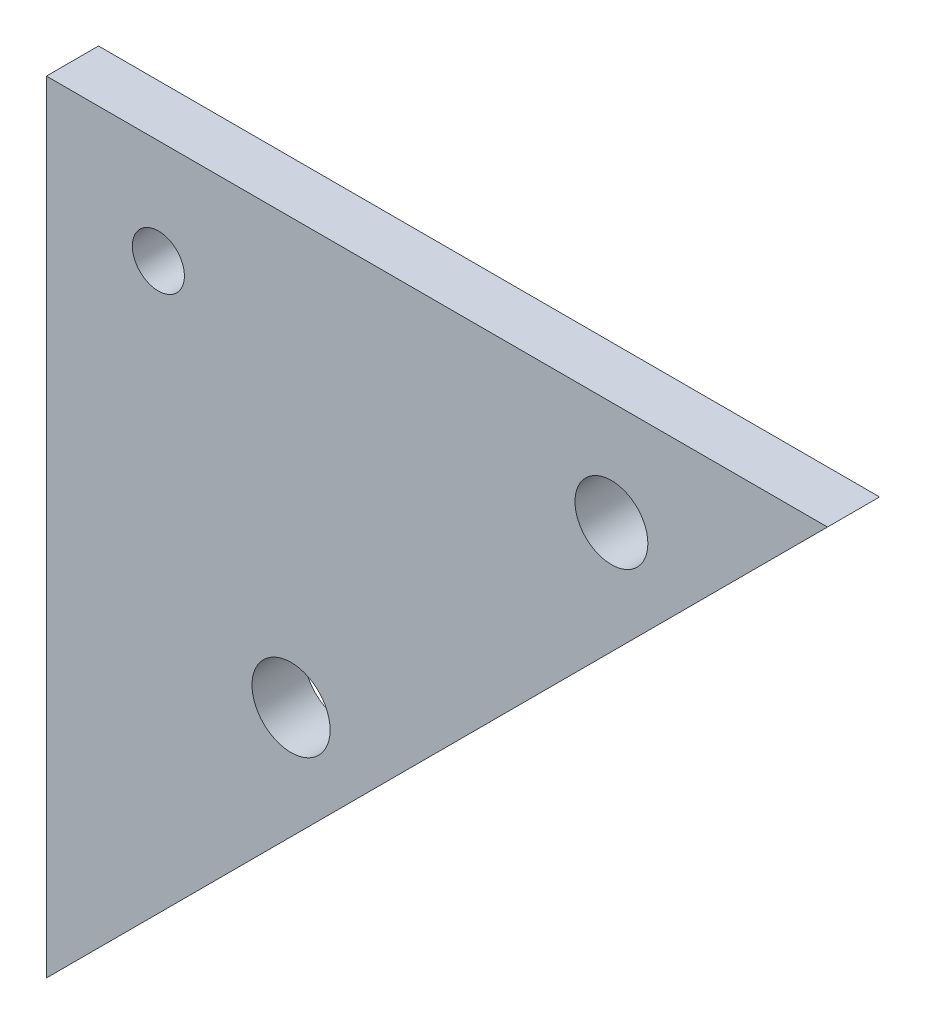
ISO-10303-21;
HEADER;
FILE_DESCRIPTION(('STEP AP214'),'2;1');
FILE_NAME('part.step','',(''),(''),'','','');
FILE_SCHEMA(('AUTOMOTIVE_DESIGN { 1 0 10303 214 1 1 1 1 }'));
ENDSEC;
DATA;
#1=APPLICATION_CONTEXT('core data for automotive mechanical design processes');
#2=APPLICATION_PROTOCOL_DEFINITION('international standard','automotive_design',2000,#1);
#3=PRODUCT_CONTEXT('',#1,'mechanical');
#4=PRODUCT('Part','Part','',(#3));
#5=PRODUCT_RELATED_PRODUCT_CATEGORY('part','',(#4));
#6=PRODUCT_DEFINITION_FORMATION('','',#4);
#7=PRODUCT_DEFINITION_CONTEXT('part definition',#1,'design');
#8=PRODUCT_DEFINITION('design','',#6,#7);
#9=PRODUCT_DEFINITION_SHAPE('','',#8);
#10=(LENGTH_UNIT() NAMED_UNIT(*) SI_UNIT(.MILLI.,.METRE.));
#11=(NAMED_UNIT(*) PLANE_ANGLE_UNIT() SI_UNIT($,.RADIAN.));
#12=(NAMED_UNIT(*) SI_UNIT($,.STERADIAN.) SOLID_ANGLE_UNIT());
#13=UNCERTAINTY_MEASURE_WITH_UNIT(LENGTH_MEASURE(1.E-05),#10,'distance_accuracy_value','');
#14=(GEOMETRIC_REPRESENTATION_CONTEXT(3) GLOBAL_UNCERTAINTY_ASSIGNED_CONTEXT((#13)) GLOBAL_UNIT_ASSIGNED_CONTEXT((#10,
#11,#12)) REPRESENTATION_CONTEXT('',''));
#15=CARTESIAN_POINT('',(0.,0.,0.));
#16=DIRECTION('',(0.,0.,1.));
#17=DIRECTION('',(1.,0.,0.));
#18=AXIS2_PLACEMENT_3D('',#15,#16,#17);
#19=CARTESIAN_POINT('',(-38.1,24.5751826876415,2.54));
#20=DIRECTION('',(1.,0.,0.));
#21=DIRECTION('',(0.,1.,0.));
#22=AXIS2_PLACEMENT_3D('',#19,#20,#21);
#23=PLANE('',#22);
#24=DIRECTION('',(0.,-1.,0.));
#25=VECTOR('',#24,1.);
#26=CARTESIAN_POINT('',(-38.1,24.5751826876415,0.));
#27=LINE('',#26,#25);
#28=CARTESIAN_POINT('',(-38.1,24.5751826876415,0.));
#29=VERTEX_POINT('',#28);
#30=CARTESIAN_POINT('',(-38.1,-13.5248173123586,0.));
#31=VERTEX_POINT('',#30);
#32=EDGE_CURVE('E83',#29,#31,#27,.T.);
#33=ORIENTED_EDGE('',*,*,#32,.T.);
#34=DIRECTION('',(0.,0.,-1.));
#35=VECTOR('',#34,1.);
#36=CARTESIAN_POINT('',(-38.1,-13.5248173123586,2.54));
#37=LINE('',#36,#35);
#38=CARTESIAN_POINT('',(-38.1,-13.5248173123586,2.54));
#39=VERTEX_POINT('',#38);
#40=EDGE_CURVE('E11',#39,#31,#37,.T.);
#41=ORIENTED_EDGE('',*,*,#40,.F.);
#42=DIRECTION('',(0.,-1.,0.));
#43=VECTOR('',#42,1.);
#44=CARTESIAN_POINT('',(-38.1,24.5751826876415,2.54));
#45=LINE('',#44,#43);
#46=CARTESIAN_POINT('',(-38.1,24.5751826876415,2.54));
#47=VERTEX_POINT('',#46);
#48=EDGE_CURVE('E76',#47,#39,#45,.T.);
#49=ORIENTED_EDGE('',*,*,#48,.F.);
#50=DIRECTION('',(0.,0.,-1.));
#51=VECTOR('',#50,1.);
#52=CARTESIAN_POINT('',(-38.1,24.5751826876415,2.54));
#53=LINE('',#52,#51);
#54=EDGE_CURVE('E84',#47,#29,#53,.T.);
#55=ORIENTED_EDGE('',*,*,#54,.T.);
#56=EDGE_LOOP('',(#33,#41,#49,#55));
#57=FACE_BOUND('',#56,.T.);
#58=ADVANCED_FACE('F36',(#57),#23,.F.);
#59=CARTESIAN_POINT('',(-38.1,-13.5248173123586,2.54));
#60=DIRECTION('',(-0.707106781186548,0.707106781186547,0.));
#61=DIRECTION('',(-0.707106781186547,-0.707106781186548,0.));
#62=AXIS2_PLACEMENT_3D('',#59,#60,#61);
#63=PLANE('',#62);
#64=DIRECTION('',(0.707106781186547,0.707106781186548,0.));
#65=VECTOR('',#64,1.);
#66=CARTESIAN_POINT('',(-38.1,-13.5248173123586,0.));
#67=LINE('',#66,#65);
#68=CARTESIAN_POINT('',(0.,24.5751826876415,0.));
#69=VERTEX_POINT('',#68);
#70=EDGE_CURVE('E64',#31,#69,#67,.T.);
#71=ORIENTED_EDGE('',*,*,#70,.T.);
#72=DIRECTION('',(0.,0.,-1.));
#73=VECTOR('',#72,1.);
#74=CARTESIAN_POINT('',(0.,24.5751826876415,2.54));
#75=LINE('',#74,#73);
#76=CARTESIAN_POINT('',(0.,24.5751826876415,2.54));
#77=VERTEX_POINT('',#76);
#78=EDGE_CURVE('E44',#77,#69,#75,.T.);
#79=ORIENTED_EDGE('',*,*,#78,.F.);
#80=DIRECTION('',(0.707106781186547,0.707106781186548,0.));
#81=VECTOR('',#80,1.);
#82=CARTESIAN_POINT('',(-38.1,-13.5248173123586,2.54));
#83=LINE('',#82,#81);
#84=EDGE_CURVE('E72',#39,#77,#83,.T.);
#85=ORIENTED_EDGE('',*,*,#84,.F.);
#86=ORIENTED_EDGE('',*,*,#40,.T.);
#87=EDGE_LOOP('',(#71,#79,#85,#86));
#88=FACE_BOUND('',#87,.T.);
#89=ADVANCED_FACE('F73',(#88),#63,.F.);
#90=CARTESIAN_POINT('',(0.,24.5751826876415,2.54));
#91=DIRECTION('',(0.,-1.,0.));
#92=DIRECTION('',(1.,0.,0.));
#93=AXIS2_PLACEMENT_3D('',#90,#91,#92);
#94=PLANE('',#93);
#95=DIRECTION('',(-1.,0.,0.));
#96=VECTOR('',#95,1.);
#97=CARTESIAN_POINT('',(0.,24.5751826876415,0.));
#98=LINE('',#97,#96);
#99=EDGE_CURVE('E69',#69,#29,#98,.T.);
#100=ORIENTED_EDGE('',*,*,#99,.T.);
#101=ORIENTED_EDGE('',*,*,#54,.F.);
#102=DIRECTION('',(-1.,0.,0.));
#103=VECTOR('',#102,1.);
#104=CARTESIAN_POINT('',(0.,24.5751826876415,2.54));
#105=LINE('',#104,#103);
#106=EDGE_CURVE('E52',#77,#47,#105,.T.);
#107=ORIENTED_EDGE('',*,*,#106,.F.);
#108=ORIENTED_EDGE('',*,*,#78,.T.);
#109=EDGE_LOOP('',(#100,#101,#107,#108));
#110=FACE_BOUND('',#109,.T.);
#111=ADVANCED_FACE('F95',(#110),#94,.F.);
#112=CARTESIAN_POINT('',(0.,0.,2.54));
#113=DIRECTION('',(0.,0.,-1.));
#114=DIRECTION('',(-1.,0.,0.));
#115=AXIS2_PLACEMENT_3D('',#112,#113,#114);
#116=PLANE('',#115);
#117=CARTESIAN_POINT('',(-32.639,19.4951826876415,2.54));
#118=DIRECTION('',(0.,0.,1.));
#119=DIRECTION('',(1.,0.,0.));
#120=AXIS2_PLACEMENT_3D('',#117,#118,#119);
#121=CIRCLE('',#120,1.27);
#122=CARTESIAN_POINT('',(-31.369,19.4951826876415,2.54));
#123=VERTEX_POINT('',#122);
#124=EDGE_CURVE('E90',#123,#123,#121,.T.);
#125=ORIENTED_EDGE('',*,*,#124,.F.);
#126=EDGE_LOOP('',(#125));
#127=FACE_BOUND('',#126,.T.);
#128=CARTESIAN_POINT('',(-10.541,19.4951826876415,2.54));
#129=DIRECTION('',(0.,0.,1.));
#130=DIRECTION('',(1.,0.,0.));
#131=AXIS2_PLACEMENT_3D('',#128,#129,#130);
#132=CIRCLE('',#131,1.778);
#133=CARTESIAN_POINT('',(-8.76300000000001,19.4951826876415,2.54));
#134=VERTEX_POINT('',#133);
#135=EDGE_CURVE('E165',#134,#134,#132,.T.);
#136=ORIENTED_EDGE('',*,*,#135,.F.);
#137=EDGE_LOOP('',(#136));
#138=FACE_BOUND('',#137,.T.);
#139=CARTESIAN_POINT('',(-26.1666456506603,3.86953703698113,2.54));
#140=DIRECTION('',(0.,0.,1.));
#141=DIRECTION('',(1.,0.,0.));
#142=AXIS2_PLACEMENT_3D('',#139,#140,#141);
#143=CIRCLE('',#142,1.905);
#144=CARTESIAN_POINT('',(-24.2616456506603,3.86953703698113,2.54));
#145=VERTEX_POINT('',#144);
#146=EDGE_CURVE('E173',#145,#145,#143,.T.);
#147=ORIENTED_EDGE('',*,*,#146,.F.);
#148=EDGE_LOOP('',(#147));
#149=FACE_BOUND('',#148,.T.);
#150=ORIENTED_EDGE('',*,*,#48,.T.);
#151=ORIENTED_EDGE('',*,*,#84,.T.);
#152=ORIENTED_EDGE('',*,*,#106,.T.);
#153=EDGE_LOOP('',(#150,#151,#152));
#154=FACE_BOUND('',#153,.T.);
#155=ADVANCED_FACE('F79',(#127,#138,#149,#154),#116,.F.);
#156=CARTESIAN_POINT('',(0.,0.,0.));
#157=DIRECTION('',(0.,0.,-1.));
#158=DIRECTION('',(-1.,0.,0.));
#159=AXIS2_PLACEMENT_3D('',#156,#157,#158);
#160=PLANE('',#159);
#161=CARTESIAN_POINT('',(-32.639,19.4951826876415,0.));
#162=DIRECTION('',(0.,0.,1.));
#163=DIRECTION('',(1.,0.,0.));
#164=AXIS2_PLACEMENT_3D('',#161,#162,#163);
#165=CIRCLE('',#164,1.27);
#166=CARTESIAN_POINT('',(-31.369,19.4951826876415,0.));
#167=VERTEX_POINT('',#166);
#168=EDGE_CURVE('E86',#167,#167,#165,.T.);
#169=ORIENTED_EDGE('',*,*,#168,.T.);
#170=EDGE_LOOP('',(#169));
#171=FACE_BOUND('',#170,.T.);
#172=CARTESIAN_POINT('',(-10.541,19.4951826876415,0.));
#173=DIRECTION('',(0.,0.,1.));
#174=DIRECTION('',(1.,0.,0.));
#175=AXIS2_PLACEMENT_3D('',#172,#173,#174);
#176=CIRCLE('',#175,1.778);
#177=CARTESIAN_POINT('',(-8.76300000000001,19.4951826876415,0.));
#178=VERTEX_POINT('',#177);
#179=EDGE_CURVE('E162',#178,#178,#176,.T.);
#180=ORIENTED_EDGE('',*,*,#179,.T.);
#181=EDGE_LOOP('',(#180));
#182=FACE_BOUND('',#181,.T.);
#183=CARTESIAN_POINT('',(-26.1666456506603,3.86953703698113,0.));
#184=DIRECTION('',(0.,0.,1.));
#185=DIRECTION('',(1.,0.,0.));
#186=AXIS2_PLACEMENT_3D('',#183,#184,#185);
#187=CIRCLE('',#186,1.905);
#188=CARTESIAN_POINT('',(-24.2616456506603,3.86953703698113,0.));
#189=VERTEX_POINT('',#188);
#190=EDGE_CURVE('E170',#189,#189,#187,.T.);
#191=ORIENTED_EDGE('',*,*,#190,.T.);
#192=EDGE_LOOP('',(#191));
#193=FACE_BOUND('',#192,.T.);
#194=ORIENTED_EDGE('',*,*,#32,.F.);
#195=ORIENTED_EDGE('',*,*,#99,.F.);
#196=ORIENTED_EDGE('',*,*,#70,.F.);
#197=EDGE_LOOP('',(#194,#195,#196));
#198=FACE_BOUND('',#197,.T.);
#199=ADVANCED_FACE('F96',(#171,#182,#193,#198),#160,.T.);
#200=CARTESIAN_POINT('',(-26.1666456506603,3.86953703698113,0.));
#201=DIRECTION('',(0.,0.,1.));
#202=DIRECTION('',(1.,0.,0.));
#203=AXIS2_PLACEMENT_3D('',#200,#201,#202);
#204=CYLINDRICAL_SURFACE('',#203,1.905);
#205=ORIENTED_EDGE('',*,*,#190,.F.);
#206=EDGE_LOOP('',(#205));
#207=FACE_BOUND('',#206,.T.);
#208=ORIENTED_EDGE('',*,*,#146,.T.);
#209=EDGE_LOOP('',(#208));
#210=FACE_BOUND('',#209,.T.);
#211=ADVANCED_FACE('F98',(#207,#210),#204,.F.);
#212=CARTESIAN_POINT('',(-10.541,19.4951826876415,0.));
#213=DIRECTION('',(0.,0.,1.));
#214=DIRECTION('',(1.,0.,0.));
#215=AXIS2_PLACEMENT_3D('',#212,#213,#214);
#216=CYLINDRICAL_SURFACE('',#215,1.778);
#217=ORIENTED_EDGE('',*,*,#179,.F.);
#218=EDGE_LOOP('',(#217));
#219=FACE_BOUND('',#218,.T.);
#220=ORIENTED_EDGE('',*,*,#135,.T.);
#221=EDGE_LOOP('',(#220));
#222=FACE_BOUND('',#221,.T.);
#223=ADVANCED_FACE('F105',(#219,#222),#216,.F.);
#224=CARTESIAN_POINT('',(-32.639,19.4951826876415,0.));
#225=DIRECTION('',(0.,0.,1.));
#226=DIRECTION('',(1.,0.,0.));
#227=AXIS2_PLACEMENT_3D('',#224,#225,#226);
#228=CYLINDRICAL_SURFACE('',#227,1.27);
#229=ORIENTED_EDGE('',*,*,#168,.F.);
#230=EDGE_LOOP('',(#229));
#231=FACE_BOUND('',#230,.T.);
#232=ORIENTED_EDGE('',*,*,#124,.T.);
#233=EDGE_LOOP('',(#232));
#234=FACE_BOUND('',#233,.T.);
#235=ADVANCED_FACE('F144',(#231,#234),#228,.F.);
#236=CLOSED_SHELL('',(#58,#89,#111,#155,#199,#211,#223,#235));
#237=MANIFOLD_SOLID_BREP('B2',#236);
#238=ADVANCED_BREP_SHAPE_REPRESENTATION('',(#18,#237),#14);
#239=SHAPE_DEFINITION_REPRESENTATION(#9,#238);
ENDSEC;
END-ISO-10303-21;
